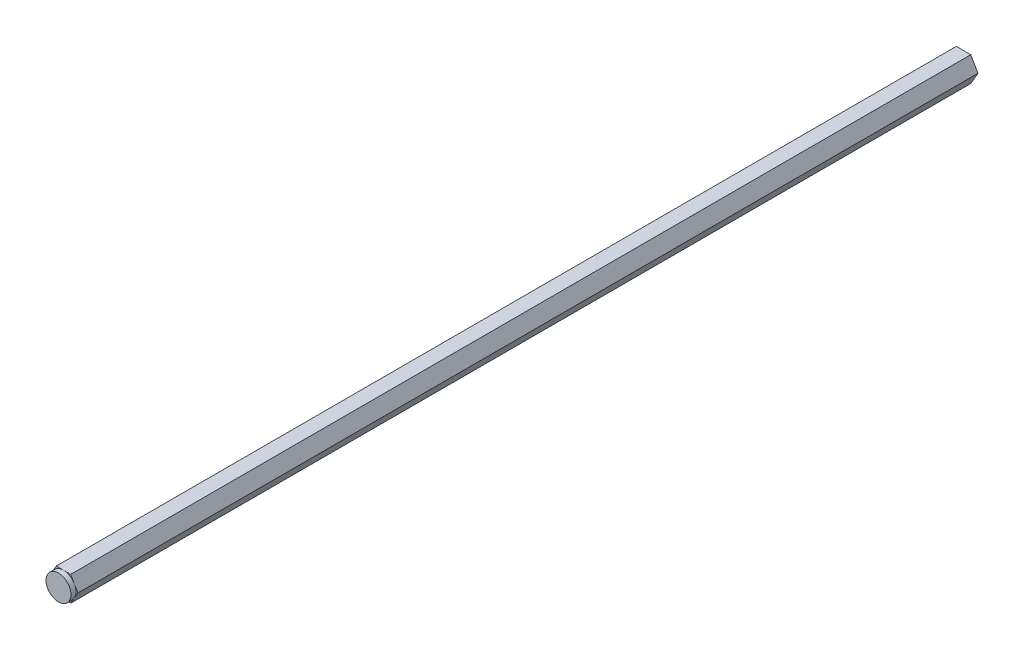
ISO-10303-21;
HEADER;
FILE_DESCRIPTION(('STEP AP214'),'2;1');
FILE_NAME('part.step','',(''),(''),'','','');
FILE_SCHEMA(('AUTOMOTIVE_DESIGN { 1 0 10303 214 1 1 1 1 }'));
ENDSEC;
DATA;
#1=APPLICATION_CONTEXT('core data for automotive mechanical design processes');
#2=APPLICATION_PROTOCOL_DEFINITION('international standard','automotive_design',2000,#1);
#3=PRODUCT_CONTEXT('',#1,'mechanical');
#4=PRODUCT('Part','Part','',(#3));
#5=PRODUCT_RELATED_PRODUCT_CATEGORY('part','',(#4));
#6=PRODUCT_DEFINITION_FORMATION('','',#4);
#7=PRODUCT_DEFINITION_CONTEXT('part definition',#1,'design');
#8=PRODUCT_DEFINITION('design','',#6,#7);
#9=PRODUCT_DEFINITION_SHAPE('','',#8);
#10=(LENGTH_UNIT() NAMED_UNIT(*) SI_UNIT(.MILLI.,.METRE.));
#11=(NAMED_UNIT(*) PLANE_ANGLE_UNIT() SI_UNIT($,.RADIAN.));
#12=(NAMED_UNIT(*) SI_UNIT($,.STERADIAN.) SOLID_ANGLE_UNIT());
#13=UNCERTAINTY_MEASURE_WITH_UNIT(LENGTH_MEASURE(1.E-05),#10,'distance_accuracy_value','');
#14=(GEOMETRIC_REPRESENTATION_CONTEXT(3) GLOBAL_UNCERTAINTY_ASSIGNED_CONTEXT((#13)) GLOBAL_UNIT_ASSIGNED_CONTEXT((#10,
#11,#12)) REPRESENTATION_CONTEXT('',''));
#15=CARTESIAN_POINT('',(0.,0.,0.));
#16=DIRECTION('',(0.,0.,1.));
#17=DIRECTION('',(1.,0.,0.));
#18=AXIS2_PLACEMENT_3D('',#15,#16,#17);
#19=CARTESIAN_POINT('',(0.,0.,457.2));
#20=DIRECTION('',(0.,0.,1.));
#21=DIRECTION('',(1.,0.,0.));
#22=AXIS2_PLACEMENT_3D('',#19,#20,#21);
#23=PLANE('',#22);
#24=CARTESIAN_POINT('',(0.,0.,457.2));
#25=DIRECTION('',(0.,0.,1.));
#26=DIRECTION('',(1.,0.,0.));
#27=AXIS2_PLACEMENT_3D('',#24,#25,#26);
#28=CIRCLE('',#27,6.35000000000001);
#29=CARTESIAN_POINT('',(5.49926131403119,3.175,457.2));
#30=VERTEX_POINT('',#29);
#31=CARTESIAN_POINT('',(0.,6.35000000000001,457.2));
#32=VERTEX_POINT('',#31);
#33=EDGE_CURVE('E45',#30,#32,#28,.T.);
#34=ORIENTED_EDGE('',*,*,#33,.F.);
#35=DIRECTION('',(-0.5,0.866025403784438,0.));
#36=VECTOR('',#35,1.);
#37=CARTESIAN_POINT('',(7.33234841870825,0.,457.2));
#38=LINE('',#37,#36);
#39=CARTESIAN_POINT('',(3.66617420935412,6.35000000000001,457.2));
#40=VERTEX_POINT('',#39);
#41=EDGE_CURVE('E120',#30,#40,#38,.T.);
#42=ORIENTED_EDGE('',*,*,#41,.T.);
#43=DIRECTION('',(-1.,0.,0.));
#44=VECTOR('',#43,1.);
#45=CARTESIAN_POINT('',(3.66617420935412,6.35000000000001,457.2));
#46=LINE('',#45,#44);
#47=EDGE_CURVE('E132',#40,#32,#46,.T.);
#48=ORIENTED_EDGE('',*,*,#47,.T.);
#49=EDGE_LOOP('',(#34,#42,#48));
#50=FACE_BOUND('',#49,.T.);
#51=ADVANCED_FACE('F34',(#50),#23,.T.);
#52=CARTESIAN_POINT('',(-5.49926131403119,3.175,457.2));
#53=VERTEX_POINT('',#52);
#54=EDGE_CURVE('E11',#32,#53,#28,.T.);
#55=ORIENTED_EDGE('',*,*,#54,.F.);
#56=CARTESIAN_POINT('',(-3.66617420935413,6.35000000000001,457.2));
#57=VERTEX_POINT('',#56);
#58=EDGE_CURVE('E119',#32,#57,#46,.T.);
#59=ORIENTED_EDGE('',*,*,#58,.T.);
#60=DIRECTION('',(-0.5,-0.866025403784439,0.));
#61=VECTOR('',#60,1.);
#62=CARTESIAN_POINT('',(-3.66617420935413,6.35000000000001,457.2));
#63=LINE('',#62,#61);
#64=EDGE_CURVE('E142',#57,#53,#63,.T.);
#65=ORIENTED_EDGE('',*,*,#64,.T.);
#66=EDGE_LOOP('',(#55,#59,#65));
#67=FACE_BOUND('',#66,.T.);
#68=ADVANCED_FACE('F205',(#67),#23,.T.);
#69=CARTESIAN_POINT('',(-5.49926131403119,-3.175,457.2));
#70=VERTEX_POINT('',#69);
#71=EDGE_CURVE('E43',#53,#70,#28,.T.);
#72=ORIENTED_EDGE('',*,*,#71,.F.);
#73=CARTESIAN_POINT('',(-7.33234841870825,0.,457.2));
#74=VERTEX_POINT('',#73);
#75=EDGE_CURVE('E141',#53,#74,#63,.T.);
#76=ORIENTED_EDGE('',*,*,#75,.T.);
#77=DIRECTION('',(0.5,-0.866025403784439,0.));
#78=VECTOR('',#77,1.);
#79=CARTESIAN_POINT('',(-7.33234841870825,0.,457.2));
#80=LINE('',#79,#78);
#81=EDGE_CURVE('E146',#74,#70,#80,.T.);
#82=ORIENTED_EDGE('',*,*,#81,.T.);
#83=EDGE_LOOP('',(#72,#76,#82));
#84=FACE_BOUND('',#83,.T.);
#85=ADVANCED_FACE('F203',(#84),#23,.T.);
#86=CARTESIAN_POINT('',(0.,-6.35000000000001,457.2));
#87=VERTEX_POINT('',#86);
#88=EDGE_CURVE('E60',#70,#87,#28,.T.);
#89=ORIENTED_EDGE('',*,*,#88,.F.);
#90=CARTESIAN_POINT('',(-3.66617420935413,-6.35000000000001,457.2));
#91=VERTEX_POINT('',#90);
#92=EDGE_CURVE('E145',#70,#91,#80,.T.);
#93=ORIENTED_EDGE('',*,*,#92,.T.);
#94=DIRECTION('',(1.,0.,0.));
#95=VECTOR('',#94,1.);
#96=CARTESIAN_POINT('',(-3.66617420935413,-6.35000000000001,457.2));
#97=LINE('',#96,#95);
#98=EDGE_CURVE('E150',#91,#87,#97,.T.);
#99=ORIENTED_EDGE('',*,*,#98,.T.);
#100=EDGE_LOOP('',(#89,#93,#99));
#101=FACE_BOUND('',#100,.T.);
#102=ADVANCED_FACE('F212',(#101),#23,.T.);
#103=CARTESIAN_POINT('',(5.49926131403119,-3.175,457.2));
#104=VERTEX_POINT('',#103);
#105=EDGE_CURVE('E52',#87,#104,#28,.T.);
#106=ORIENTED_EDGE('',*,*,#105,.F.);
#107=CARTESIAN_POINT('',(3.66617420935412,-6.35000000000001,457.2));
#108=VERTEX_POINT('',#107);
#109=EDGE_CURVE('E149',#87,#108,#97,.T.);
#110=ORIENTED_EDGE('',*,*,#109,.T.);
#111=DIRECTION('',(0.5,0.866025403784439,0.));
#112=VECTOR('',#111,1.);
#113=CARTESIAN_POINT('',(3.66617420935412,-6.35000000000001,457.2));
#114=LINE('',#113,#112);
#115=EDGE_CURVE('E130',#108,#104,#114,.T.);
#116=ORIENTED_EDGE('',*,*,#115,.T.);
#117=EDGE_LOOP('',(#106,#110,#116));
#118=FACE_BOUND('',#117,.T.);
#119=ADVANCED_FACE('F217',(#118),#23,.T.);
#120=CARTESIAN_POINT('',(3.66617420935412,-6.35000000000001,457.2));
#121=DIRECTION('',(-0.866025403784439,0.5,0.));
#122=DIRECTION('',(-0.5,-0.866025403784439,0.));
#123=AXIS2_PLACEMENT_3D('',#120,#121,#122);
#124=PLANE('',#123);
#125=DIRECTION('',(0.5,0.866025403784439,0.));
#126=VECTOR('',#125,1.);
#127=CARTESIAN_POINT('',(3.66617420935412,-6.35000000000001,0.));
#128=LINE('',#127,#126);
#129=CARTESIAN_POINT('',(3.66617420935412,-6.35000000000001,0.));
#130=VERTEX_POINT('',#129);
#131=CARTESIAN_POINT('',(7.33234841870825,0.,0.));
#132=VERTEX_POINT('',#131);
#133=EDGE_CURVE('E153',#130,#132,#128,.T.);
#134=ORIENTED_EDGE('',*,*,#133,.T.);
#135=DIRECTION('',(0.,0.,-1.));
#136=VECTOR('',#135,1.);
#137=CARTESIAN_POINT('',(7.33234841870825,0.,457.2));
#138=LINE('',#137,#136);
#139=CARTESIAN_POINT('',(7.33234841870825,0.,457.2));
#140=VERTEX_POINT('',#139);
#141=EDGE_CURVE('E38',#140,#132,#138,.T.);
#142=ORIENTED_EDGE('',*,*,#141,.F.);
#143=EDGE_CURVE('E115',#104,#140,#114,.T.);
#144=ORIENTED_EDGE('',*,*,#143,.F.);
#145=ORIENTED_EDGE('',*,*,#115,.F.);
#146=DIRECTION('',(0.,0.,-1.));
#147=VECTOR('',#146,1.);
#148=CARTESIAN_POINT('',(3.66617420935412,-6.35000000000001,457.2));
#149=LINE('',#148,#147);
#150=EDGE_CURVE('E152',#108,#130,#149,.T.);
#151=ORIENTED_EDGE('',*,*,#150,.T.);
#152=EDGE_LOOP('',(#134,#142,#144,#145,#151));
#153=FACE_BOUND('',#152,.T.);
#154=ADVANCED_FACE('F36',(#153),#124,.F.);
#155=CARTESIAN_POINT('',(7.33234841870825,0.,457.2));
#156=DIRECTION('',(-0.866025403784439,-0.5,0.));
#157=DIRECTION('',(0.5,-0.866025403784439,0.));
#158=AXIS2_PLACEMENT_3D('',#155,#156,#157);
#159=PLANE('',#158);
#160=DIRECTION('',(-0.5,0.866025403784438,0.));
#161=VECTOR('',#160,1.);
#162=CARTESIAN_POINT('',(7.33234841870825,0.,0.));
#163=LINE('',#162,#161);
#164=CARTESIAN_POINT('',(3.66617420935412,6.35000000000001,0.));
#165=VERTEX_POINT('',#164);
#166=EDGE_CURVE('E156',#132,#165,#163,.T.);
#167=ORIENTED_EDGE('',*,*,#166,.T.);
#168=DIRECTION('',(0.,0.,-1.));
#169=VECTOR('',#168,1.);
#170=CARTESIAN_POINT('',(3.66617420935412,6.35000000000001,457.2));
#171=LINE('',#170,#169);
#172=EDGE_CURVE('E126',#40,#165,#171,.T.);
#173=ORIENTED_EDGE('',*,*,#172,.F.);
#174=ORIENTED_EDGE('',*,*,#41,.F.);
#175=EDGE_CURVE('E109',#140,#30,#38,.T.);
#176=ORIENTED_EDGE('',*,*,#175,.F.);
#177=ORIENTED_EDGE('',*,*,#141,.T.);
#178=EDGE_LOOP('',(#167,#173,#174,#176,#177));
#179=FACE_BOUND('',#178,.T.);
#180=ADVANCED_FACE('F124',(#179),#159,.F.);
#181=CARTESIAN_POINT('',(3.66617420935412,6.35000000000001,457.2));
#182=DIRECTION('',(0.,-1.,0.));
#183=DIRECTION('',(1.,0.,0.));
#184=AXIS2_PLACEMENT_3D('',#181,#182,#183);
#185=PLANE('',#184);
#186=DIRECTION('',(-1.,0.,0.));
#187=VECTOR('',#186,1.);
#188=CARTESIAN_POINT('',(3.66617420935412,6.35000000000001,0.));
#189=LINE('',#188,#187);
#190=CARTESIAN_POINT('',(-3.66617420935413,6.35000000000001,0.));
#191=VERTEX_POINT('',#190);
#192=EDGE_CURVE('E158',#165,#191,#189,.T.);
#193=ORIENTED_EDGE('',*,*,#192,.T.);
#194=DIRECTION('',(0.,0.,-1.));
#195=VECTOR('',#194,1.);
#196=CARTESIAN_POINT('',(-3.66617420935413,6.35000000000001,457.2));
#197=LINE('',#196,#195);
#198=EDGE_CURVE('E177',#57,#191,#197,.T.);
#199=ORIENTED_EDGE('',*,*,#198,.F.);
#200=ORIENTED_EDGE('',*,*,#58,.F.);
#201=ORIENTED_EDGE('',*,*,#47,.F.);
#202=ORIENTED_EDGE('',*,*,#172,.T.);
#203=EDGE_LOOP('',(#193,#199,#200,#201,#202));
#204=FACE_BOUND('',#203,.T.);
#205=ADVANCED_FACE('F183',(#204),#185,.F.);
#206=CARTESIAN_POINT('',(-3.66617420935413,6.35000000000001,457.2));
#207=DIRECTION('',(0.866025403784439,-0.5,0.));
#208=DIRECTION('',(0.5,0.866025403784439,0.));
#209=AXIS2_PLACEMENT_3D('',#206,#207,#208);
#210=PLANE('',#209);
#211=DIRECTION('',(-0.5,-0.866025403784439,0.));
#212=VECTOR('',#211,1.);
#213=CARTESIAN_POINT('',(-3.66617420935413,6.35000000000001,0.));
#214=LINE('',#213,#212);
#215=CARTESIAN_POINT('',(-7.33234841870825,0.,0.));
#216=VERTEX_POINT('',#215);
#217=EDGE_CURVE('E160',#191,#216,#214,.T.);
#218=ORIENTED_EDGE('',*,*,#217,.T.);
#219=DIRECTION('',(0.,0.,-1.));
#220=VECTOR('',#219,1.);
#221=CARTESIAN_POINT('',(-7.33234841870825,0.,457.2));
#222=LINE('',#221,#220);
#223=EDGE_CURVE('E173',#74,#216,#222,.T.);
#224=ORIENTED_EDGE('',*,*,#223,.F.);
#225=ORIENTED_EDGE('',*,*,#75,.F.);
#226=ORIENTED_EDGE('',*,*,#64,.F.);
#227=ORIENTED_EDGE('',*,*,#198,.T.);
#228=EDGE_LOOP('',(#218,#224,#225,#226,#227));
#229=FACE_BOUND('',#228,.T.);
#230=ADVANCED_FACE('F194',(#229),#210,.F.);
#231=CARTESIAN_POINT('',(-7.33234841870825,0.,457.2));
#232=DIRECTION('',(0.866025403784439,0.5,0.));
#233=DIRECTION('',(-0.5,0.866025403784439,0.));
#234=AXIS2_PLACEMENT_3D('',#231,#232,#233);
#235=PLANE('',#234);
#236=DIRECTION('',(0.5,-0.866025403784439,0.));
#237=VECTOR('',#236,1.);
#238=CARTESIAN_POINT('',(-7.33234841870825,0.,0.));
#239=LINE('',#238,#237);
#240=CARTESIAN_POINT('',(-3.66617420935413,-6.35000000000001,0.));
#241=VERTEX_POINT('',#240);
#242=EDGE_CURVE('E162',#216,#241,#239,.T.);
#243=ORIENTED_EDGE('',*,*,#242,.T.);
#244=DIRECTION('',(0.,0.,-1.));
#245=VECTOR('',#244,1.);
#246=CARTESIAN_POINT('',(-3.66617420935413,-6.35000000000001,457.2));
#247=LINE('',#246,#245);
#248=EDGE_CURVE('E169',#91,#241,#247,.T.);
#249=ORIENTED_EDGE('',*,*,#248,.F.);
#250=ORIENTED_EDGE('',*,*,#92,.F.);
#251=ORIENTED_EDGE('',*,*,#81,.F.);
#252=ORIENTED_EDGE('',*,*,#223,.T.);
#253=EDGE_LOOP('',(#243,#249,#250,#251,#252));
#254=FACE_BOUND('',#253,.T.);
#255=ADVANCED_FACE('F199',(#254),#235,.F.);
#256=CARTESIAN_POINT('',(-3.66617420935413,-6.35000000000001,457.2));
#257=DIRECTION('',(0.,1.,0.));
#258=DIRECTION('',(0.,0.,1.));
#259=AXIS2_PLACEMENT_3D('',#256,#257,#258);
#260=PLANE('',#259);
#261=DIRECTION('',(1.,0.,0.));
#262=VECTOR('',#261,1.);
#263=CARTESIAN_POINT('',(-3.66617420935413,-6.35000000000001,0.));
#264=LINE('',#263,#262);
#265=EDGE_CURVE('E164',#241,#130,#264,.T.);
#266=ORIENTED_EDGE('',*,*,#265,.T.);
#267=ORIENTED_EDGE('',*,*,#150,.F.);
#268=ORIENTED_EDGE('',*,*,#109,.F.);
#269=ORIENTED_EDGE('',*,*,#98,.F.);
#270=ORIENTED_EDGE('',*,*,#248,.T.);
#271=EDGE_LOOP('',(#266,#267,#268,#269,#270));
#272=FACE_BOUND('',#271,.T.);
#273=ADVANCED_FACE('F216',(#272),#260,.F.);
#274=EDGE_CURVE('E113',#104,#30,#28,.T.);
#275=ORIENTED_EDGE('',*,*,#274,.F.);
#276=ORIENTED_EDGE('',*,*,#143,.T.);
#277=ORIENTED_EDGE('',*,*,#175,.T.);
#278=EDGE_LOOP('',(#275,#276,#277));
#279=FACE_BOUND('',#278,.T.);
#280=ADVANCED_FACE('F111',(#279),#23,.T.);
#281=CARTESIAN_POINT('',(0.,0.,0.));
#282=DIRECTION('',(0.,0.,1.));
#283=DIRECTION('',(1.,0.,0.));
#284=AXIS2_PLACEMENT_3D('',#281,#282,#283);
#285=PLANE('',#284);
#286=ORIENTED_EDGE('',*,*,#133,.F.);
#287=ORIENTED_EDGE('',*,*,#265,.F.);
#288=ORIENTED_EDGE('',*,*,#242,.F.);
#289=ORIENTED_EDGE('',*,*,#217,.F.);
#290=ORIENTED_EDGE('',*,*,#192,.F.);
#291=ORIENTED_EDGE('',*,*,#166,.F.);
#292=EDGE_LOOP('',(#286,#287,#288,#289,#290,#291));
#293=FACE_BOUND('',#292,.T.);
#294=ADVANCED_FACE('F189',(#293),#285,.F.);
#295=CARTESIAN_POINT('',(0.,0.,459.74));
#296=DIRECTION('',(0.,0.,-1.));
#297=DIRECTION('',(-1.,0.,0.));
#298=AXIS2_PLACEMENT_3D('',#295,#296,#297);
#299=CYLINDRICAL_SURFACE('',#298,6.35000000000001);
#300=CARTESIAN_POINT('',(0.,0.,459.74));
#301=DIRECTION('',(0.,0.,1.));
#302=DIRECTION('',(1.,0.,0.));
#303=AXIS2_PLACEMENT_3D('',#300,#301,#302);
#304=CIRCLE('',#303,6.35000000000001);
#305=CARTESIAN_POINT('',(6.35000000000001,0.,459.74));
#306=VERTEX_POINT('',#305);
#307=EDGE_CURVE('E134',#306,#306,#304,.T.);
#308=ORIENTED_EDGE('',*,*,#307,.F.);
#309=EDGE_LOOP('',(#308));
#310=FACE_BOUND('',#309,.T.);
#311=ORIENTED_EDGE('',*,*,#33,.T.);
#312=ORIENTED_EDGE('',*,*,#54,.T.);
#313=ORIENTED_EDGE('',*,*,#71,.T.);
#314=ORIENTED_EDGE('',*,*,#88,.T.);
#315=ORIENTED_EDGE('',*,*,#105,.T.);
#316=ORIENTED_EDGE('',*,*,#274,.T.);
#317=EDGE_LOOP('',(#311,#312,#313,#314,#315,#316));
#318=FACE_BOUND('',#317,.T.);
#319=ADVANCED_FACE('F135',(#310,#318),#299,.T.);
#320=CARTESIAN_POINT('',(0.,0.,459.74));
#321=DIRECTION('',(0.,0.,1.));
#322=DIRECTION('',(1.,0.,0.));
#323=AXIS2_PLACEMENT_3D('',#320,#321,#322);
#324=PLANE('',#323);
#325=ORIENTED_EDGE('',*,*,#307,.T.);
#326=EDGE_LOOP('',(#325));
#327=FACE_BOUND('',#326,.T.);
#328=ADVANCED_FACE('F297',(#327),#324,.T.);
#329=CLOSED_SHELL('',(#51,#68,#85,#102,#119,#154,#180,#205,#230,#255,#273,#280,#294,#319,#328));
#330=MANIFOLD_SOLID_BREP('B2',#329);
#331=ADVANCED_BREP_SHAPE_REPRESENTATION('',(#18,#330),#14);
#332=SHAPE_DEFINITION_REPRESENTATION(#9,#331);
ENDSEC;
END-ISO-10303-21;
